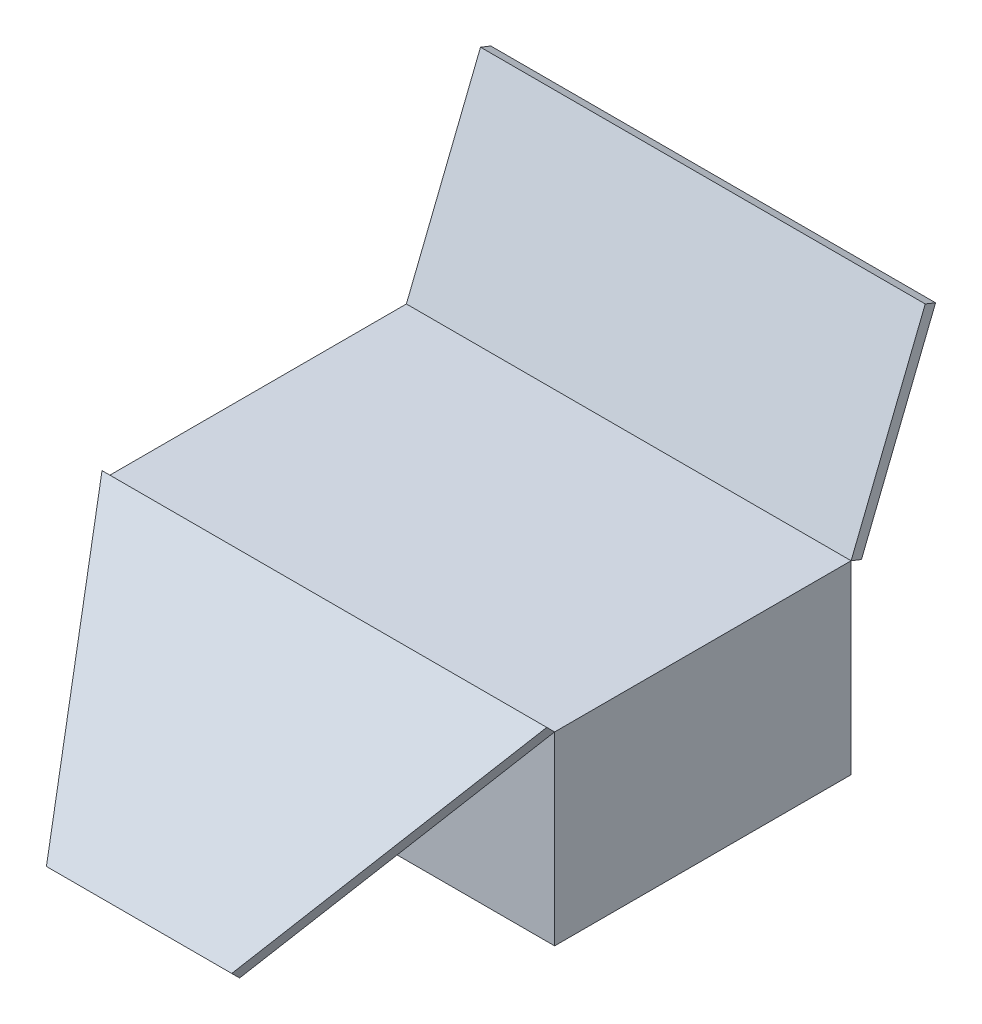
ISO-10303-21;
HEADER;
FILE_DESCRIPTION(('STEP AP214'),'2;1');
FILE_NAME('part.step','',(''),(''),'','','');
FILE_SCHEMA(('AUTOMOTIVE_DESIGN { 1 0 10303 214 1 1 1 1 }'));
ENDSEC;
DATA;
#1=APPLICATION_CONTEXT('core data for automotive mechanical design processes');
#2=APPLICATION_PROTOCOL_DEFINITION('international standard','automotive_design',2000,#1);
#3=PRODUCT_CONTEXT('',#1,'mechanical');
#4=PRODUCT('Part','Part','',(#3));
#5=PRODUCT_RELATED_PRODUCT_CATEGORY('part','',(#4));
#6=PRODUCT_DEFINITION_FORMATION('','',#4);
#7=PRODUCT_DEFINITION_CONTEXT('part definition',#1,'design');
#8=PRODUCT_DEFINITION('design','',#6,#7);
#9=PRODUCT_DEFINITION_SHAPE('','',#8);
#10=(LENGTH_UNIT() NAMED_UNIT(*) SI_UNIT(.MILLI.,.METRE.));
#11=(NAMED_UNIT(*) PLANE_ANGLE_UNIT() SI_UNIT($,.RADIAN.));
#12=(NAMED_UNIT(*) SI_UNIT($,.STERADIAN.) SOLID_ANGLE_UNIT());
#13=UNCERTAINTY_MEASURE_WITH_UNIT(LENGTH_MEASURE(1.E-05),#10,'distance_accuracy_value','');
#14=(GEOMETRIC_REPRESENTATION_CONTEXT(3) GLOBAL_UNCERTAINTY_ASSIGNED_CONTEXT((#13)) GLOBAL_UNIT_ASSIGNED_CONTEXT((#10,
#11,#12)) REPRESENTATION_CONTEXT('',''));
#15=CARTESIAN_POINT('',(0.,0.,0.));
#16=DIRECTION('',(0.,0.,1.));
#17=DIRECTION('',(1.,0.,0.));
#18=AXIS2_PLACEMENT_3D('',#15,#16,#17);
#19=CARTESIAN_POINT('',(28.125,2.12132034355964,87.1213203435597));
#20=DIRECTION('',(0.,0.707106781186548,-0.707106781186547));
#21=DIRECTION('',(0.,0.707106781186547,0.707106781186548));
#22=AXIS2_PLACEMENT_3D('',#19,#20,#21);
#23=PLANE('',#22);
#24=DIRECTION('',(1.,0.,0.));
#25=VECTOR('',#24,1.);
#26=CARTESIAN_POINT('',(28.125,0.,85.));
#27=LINE('',#26,#25);
#28=CARTESIAN_POINT('',(-21.875,0.,85.));
#29=VERTEX_POINT('',#28);
#30=CARTESIAN_POINT('',(28.125,0.,85.));
#31=VERTEX_POINT('',#30);
#32=EDGE_CURVE('E115',#29,#31,#27,.T.);
#33=ORIENTED_EDGE('',*,*,#32,.T.);
#34=DIRECTION('',(0.,-0.707106781186547,-0.707106781186548));
#35=VECTOR('',#34,1.);
#36=CARTESIAN_POINT('',(28.125,2.12132034355964,87.1213203435597));
#37=LINE('',#36,#35);
#38=CARTESIAN_POINT('',(28.125,2.12132034355964,87.1213203435597));
#39=VERTEX_POINT('',#38);
#40=EDGE_CURVE('E12',#39,#31,#37,.T.);
#41=ORIENTED_EDGE('',*,*,#40,.F.);
#42=DIRECTION('',(1.,0.,0.));
#43=VECTOR('',#42,1.);
#44=CARTESIAN_POINT('',(28.125,2.12132034355964,87.1213203435597));
#45=LINE('',#44,#43);
#46=CARTESIAN_POINT('',(-21.875,2.12132034355964,87.1213203435597));
#47=VERTEX_POINT('',#46);
#48=EDGE_CURVE('E99',#47,#39,#45,.T.);
#49=ORIENTED_EDGE('',*,*,#48,.F.);
#50=DIRECTION('',(0.,-0.707106781186547,-0.707106781186548));
#51=VECTOR('',#50,1.);
#52=CARTESIAN_POINT('',(-21.875,2.12132034355964,87.1213203435597));
#53=LINE('',#52,#51);
#54=EDGE_CURVE('E107',#47,#29,#53,.T.);
#55=ORIENTED_EDGE('',*,*,#54,.T.);
#56=EDGE_LOOP('',(#33,#41,#49,#55));
#57=FACE_BOUND('',#56,.T.);
#58=ADVANCED_FACE('F47',(#57),#23,.F.);
#59=CARTESIAN_POINT('',(63.125,52.1213203435596,37.1213203435597));
#60=DIRECTION('',(-0.896221429896442,0.313677500463755,-0.313677500463754));
#61=DIRECTION('',(-0.330350424728106,-0.943858356366017,0.));
#62=AXIS2_PLACEMENT_3D('',#59,#60,#61);
#63=PLANE('',#62);
#64=DIRECTION('',(0.443606975367134,0.633724250524478,-0.633724250524478));
#65=VECTOR('',#64,1.);
#66=CARTESIAN_POINT('',(63.125,50.,35.));
#67=LINE('',#66,#65);
#68=CARTESIAN_POINT('',(63.125,50.,35.));
#69=VERTEX_POINT('',#68);
#70=EDGE_CURVE('E102',#31,#69,#67,.T.);
#71=ORIENTED_EDGE('',*,*,#70,.T.);
#72=DIRECTION('',(0.,-0.707106781186547,-0.707106781186548));
#73=VECTOR('',#72,1.);
#74=CARTESIAN_POINT('',(63.125,52.1213203435596,37.1213203435597));
#75=LINE('',#74,#73);
#76=CARTESIAN_POINT('',(63.125,52.1213203435596,37.1213203435597));
#77=VERTEX_POINT('',#76);
#78=EDGE_CURVE('E60',#77,#69,#75,.T.);
#79=ORIENTED_EDGE('',*,*,#78,.F.);
#80=DIRECTION('',(0.443606975367134,0.633724250524478,-0.633724250524478));
#81=VECTOR('',#80,1.);
#82=CARTESIAN_POINT('',(63.125,52.1213203435596,37.1213203435597));
#83=LINE('',#82,#81);
#84=EDGE_CURVE('E92',#39,#77,#83,.T.);
#85=ORIENTED_EDGE('',*,*,#84,.F.);
#86=ORIENTED_EDGE('',*,*,#40,.T.);
#87=EDGE_LOOP('',(#71,#79,#85,#86));
#88=FACE_BOUND('',#87,.T.);
#89=ADVANCED_FACE('F103',(#88),#63,.F.);
#90=CARTESIAN_POINT('',(-56.875,52.1213203435596,37.1213203435597));
#91=DIRECTION('',(0.,-0.707106781186548,0.707106781186547));
#92=DIRECTION('',(0.,-0.707106781186547,-0.707106781186548));
#93=AXIS2_PLACEMENT_3D('',#90,#91,#92);
#94=PLANE('',#93);
#95=DIRECTION('',(-1.,0.,0.));
#96=VECTOR('',#95,1.);
#97=CARTESIAN_POINT('',(-56.875,50.,35.));
#98=LINE('',#97,#96);
#99=CARTESIAN_POINT('',(-56.875,50.,35.));
#100=VERTEX_POINT('',#99);
#101=EDGE_CURVE('E85',#69,#100,#98,.T.);
#102=ORIENTED_EDGE('',*,*,#101,.T.);
#103=DIRECTION('',(0.,-0.707106781186547,-0.707106781186548));
#104=VECTOR('',#103,1.);
#105=CARTESIAN_POINT('',(-56.875,52.1213203435596,37.1213203435597));
#106=LINE('',#105,#104);
#107=CARTESIAN_POINT('',(-56.875,52.1213203435596,37.1213203435597));
#108=VERTEX_POINT('',#107);
#109=EDGE_CURVE('E104',#108,#100,#106,.T.);
#110=ORIENTED_EDGE('',*,*,#109,.F.);
#111=DIRECTION('',(-1.,0.,0.));
#112=VECTOR('',#111,1.);
#113=CARTESIAN_POINT('',(-56.875,52.1213203435596,37.1213203435597));
#114=LINE('',#113,#112);
#115=EDGE_CURVE('E98',#77,#108,#114,.T.);
#116=ORIENTED_EDGE('',*,*,#115,.F.);
#117=ORIENTED_EDGE('',*,*,#78,.T.);
#118=EDGE_LOOP('',(#102,#110,#116,#117));
#119=FACE_BOUND('',#118,.T.);
#120=ADVANCED_FACE('F106',(#119),#94,.F.);
#121=CARTESIAN_POINT('',(-21.875,2.12132034355964,87.1213203435597));
#122=DIRECTION('',(0.896221429896442,0.313677500463755,-0.313677500463754));
#123=DIRECTION('',(-0.330350424728106,0.943858356366017,0.));
#124=AXIS2_PLACEMENT_3D('',#121,#122,#123);
#125=PLANE('',#124);
#126=DIRECTION('',(0.443606975367134,-0.633724250524478,0.633724250524478));
#127=VECTOR('',#126,1.);
#128=CARTESIAN_POINT('',(-21.875,0.,85.));
#129=LINE('',#128,#127);
#130=EDGE_CURVE('E86',#100,#29,#129,.T.);
#131=ORIENTED_EDGE('',*,*,#130,.T.);
#132=ORIENTED_EDGE('',*,*,#54,.F.);
#133=DIRECTION('',(0.443606975367134,-0.633724250524478,0.633724250524478));
#134=VECTOR('',#133,1.);
#135=CARTESIAN_POINT('',(-21.875,2.12132034355964,87.1213203435597));
#136=LINE('',#135,#134);
#137=EDGE_CURVE('E63',#108,#47,#136,.T.);
#138=ORIENTED_EDGE('',*,*,#137,.F.);
#139=ORIENTED_EDGE('',*,*,#109,.T.);
#140=EDGE_LOOP('',(#131,#132,#138,#139));
#141=FACE_BOUND('',#140,.T.);
#142=ADVANCED_FACE('F116',(#141),#125,.F.);
#143=CARTESIAN_POINT('',(0.,44.6213203435596,44.6213203435597));
#144=DIRECTION('',(0.,-0.707106781186547,-0.707106781186548));
#145=DIRECTION('',(0.,0.707106781186548,-0.707106781186547));
#146=AXIS2_PLACEMENT_3D('',#143,#144,#145);
#147=PLANE('',#146);
#148=ORIENTED_EDGE('',*,*,#48,.T.);
#149=ORIENTED_EDGE('',*,*,#84,.T.);
#150=ORIENTED_EDGE('',*,*,#115,.T.);
#151=ORIENTED_EDGE('',*,*,#137,.T.);
#152=EDGE_LOOP('',(#148,#149,#150,#151));
#153=FACE_BOUND('',#152,.T.);
#154=ADVANCED_FACE('F96',(#153),#147,.F.);
#155=CARTESIAN_POINT('',(0.,42.5,42.5));
#156=DIRECTION('',(0.,-0.707106781186547,-0.707106781186548));
#157=DIRECTION('',(0.,0.707106781186548,-0.707106781186547));
#158=AXIS2_PLACEMENT_3D('',#155,#156,#157);
#159=PLANE('',#158);
#160=ORIENTED_EDGE('',*,*,#32,.F.);
#161=ORIENTED_EDGE('',*,*,#130,.F.);
#162=ORIENTED_EDGE('',*,*,#101,.F.);
#163=ORIENTED_EDGE('',*,*,#70,.F.);
#164=EDGE_LOOP('',(#160,#161,#162,#163));
#165=FACE_BOUND('',#164,.T.);
#166=ADVANCED_FACE('F125',(#165),#159,.T.);
#167=CLOSED_SHELL('',(#58,#89,#120,#142,#154,#166));
#168=MANIFOLD_SOLID_BREP('B2',#167);
#169=CARTESIAN_POINT('',(63.125,98.8858279709377,-67.7854300726558));
#170=DIRECTION('',(-1.,0.,0.));
#171=DIRECTION('',(0.,0.,1.));
#172=AXIS2_PLACEMENT_3D('',#169,#170,#171);
#173=PLANE('',#172);
#174=DIRECTION('',(0.,-0.928476690885259,0.371390676354104));
#175=VECTOR('',#174,1.);
#176=CARTESIAN_POINT('',(63.125,100.,-65.));
#177=LINE('',#176,#175);
#178=CARTESIAN_POINT('',(63.125,100.,-65.));
#179=VERTEX_POINT('',#178);
#180=CARTESIAN_POINT('',(63.125,50.,-45.));
#181=VERTEX_POINT('',#180);
#182=EDGE_CURVE('E241',#179,#181,#177,.T.);
#183=ORIENTED_EDGE('',*,*,#182,.T.);
#184=DIRECTION('',(0.,0.371390676354104,0.928476690885259));
#185=VECTOR('',#184,1.);
#186=CARTESIAN_POINT('',(63.125,48.8858279709377,-47.7854300726558));
#187=LINE('',#186,#185);
#188=CARTESIAN_POINT('',(63.125,48.8858279709377,-47.7854300726558));
#189=VERTEX_POINT('',#188);
#190=EDGE_CURVE('E50',#189,#181,#187,.T.);
#191=ORIENTED_EDGE('',*,*,#190,.F.);
#192=DIRECTION('',(0.,-0.928476690885259,0.371390676354104));
#193=VECTOR('',#192,1.);
#194=CARTESIAN_POINT('',(63.125,98.8858279709377,-67.7854300726558));
#195=LINE('',#194,#193);
#196=CARTESIAN_POINT('',(63.125,98.8858279709377,-67.7854300726558));
#197=VERTEX_POINT('',#196);
#198=EDGE_CURVE('E235',#197,#189,#195,.T.);
#199=ORIENTED_EDGE('',*,*,#198,.F.);
#200=DIRECTION('',(0.,0.371390676354104,0.928476690885259));
#201=VECTOR('',#200,1.);
#202=CARTESIAN_POINT('',(63.125,98.8858279709377,-67.7854300726558));
#203=LINE('',#202,#201);
#204=EDGE_CURVE('E238',#197,#179,#203,.T.);
#205=ORIENTED_EDGE('',*,*,#204,.T.);
#206=EDGE_LOOP('',(#183,#191,#199,#205));
#207=FACE_BOUND('',#206,.T.);
#208=ADVANCED_FACE('F182',(#207),#173,.F.);
#209=CARTESIAN_POINT('',(63.125,48.8858279709377,-47.7854300726558));
#210=DIRECTION('',(0.,0.928476690885259,-0.371390676354104));
#211=DIRECTION('',(0.,0.371390676354104,0.928476690885259));
#212=AXIS2_PLACEMENT_3D('',#209,#210,#211);
#213=PLANE('',#212);
#214=DIRECTION('',(-1.,0.,0.));
#215=VECTOR('',#214,1.);
#216=CARTESIAN_POINT('',(63.125,50.,-45.));
#217=LINE('',#216,#215);
#218=CARTESIAN_POINT('',(-56.875,50.,-45.));
#219=VERTEX_POINT('',#218);
#220=EDGE_CURVE('E237',#181,#219,#217,.T.);
#221=ORIENTED_EDGE('',*,*,#220,.T.);
#222=DIRECTION('',(0.,0.371390676354104,0.928476690885259));
#223=VECTOR('',#222,1.);
#224=CARTESIAN_POINT('',(-56.875,48.8858279709377,-47.7854300726558));
#225=LINE('',#224,#223);
#226=CARTESIAN_POINT('',(-56.875,48.8858279709377,-47.7854300726558));
#227=VERTEX_POINT('',#226);
#228=EDGE_CURVE('E186',#227,#219,#225,.T.);
#229=ORIENTED_EDGE('',*,*,#228,.F.);
#230=DIRECTION('',(-1.,0.,0.));
#231=VECTOR('',#230,1.);
#232=CARTESIAN_POINT('',(63.125,48.8858279709377,-47.7854300726558));
#233=LINE('',#232,#231);
#234=EDGE_CURVE('E230',#189,#227,#233,.T.);
#235=ORIENTED_EDGE('',*,*,#234,.F.);
#236=ORIENTED_EDGE('',*,*,#190,.T.);
#237=EDGE_LOOP('',(#221,#229,#235,#236));
#238=FACE_BOUND('',#237,.T.);
#239=ADVANCED_FACE('F234',(#238),#213,.F.);
#240=CARTESIAN_POINT('',(-56.875,98.8858279709377,-67.7854300726558));
#241=DIRECTION('',(1.,0.,0.));
#242=DIRECTION('',(0.,0.,-1.));
#243=AXIS2_PLACEMENT_3D('',#240,#241,#242);
#244=PLANE('',#243);
#245=DIRECTION('',(0.,0.928476690885259,-0.371390676354104));
#246=VECTOR('',#245,1.);
#247=CARTESIAN_POINT('',(-56.875,100.,-65.));
#248=LINE('',#247,#246);
#249=CARTESIAN_POINT('',(-56.875,100.,-65.));
#250=VERTEX_POINT('',#249);
#251=EDGE_CURVE('E212',#219,#250,#248,.T.);
#252=ORIENTED_EDGE('',*,*,#251,.T.);
#253=DIRECTION('',(0.,0.371390676354104,0.928476690885259));
#254=VECTOR('',#253,1.);
#255=CARTESIAN_POINT('',(-56.875,98.8858279709377,-67.7854300726558));
#256=LINE('',#255,#254);
#257=CARTESIAN_POINT('',(-56.875,98.8858279709377,-67.7854300726558));
#258=VERTEX_POINT('',#257);
#259=EDGE_CURVE('E240',#258,#250,#256,.T.);
#260=ORIENTED_EDGE('',*,*,#259,.F.);
#261=DIRECTION('',(0.,0.928476690885259,-0.371390676354104));
#262=VECTOR('',#261,1.);
#263=CARTESIAN_POINT('',(-56.875,98.8858279709377,-67.7854300726558));
#264=LINE('',#263,#262);
#265=EDGE_CURVE('E228',#227,#258,#264,.T.);
#266=ORIENTED_EDGE('',*,*,#265,.F.);
#267=ORIENTED_EDGE('',*,*,#228,.T.);
#268=EDGE_LOOP('',(#252,#260,#266,#267));
#269=FACE_BOUND('',#268,.T.);
#270=ADVANCED_FACE('F236',(#269),#244,.F.);
#271=CARTESIAN_POINT('',(63.125,98.8858279709377,-67.7854300726558));
#272=DIRECTION('',(0.,-0.928476690885259,0.371390676354104));
#273=DIRECTION('',(0.,-0.371390676354104,-0.928476690885259));
#274=AXIS2_PLACEMENT_3D('',#271,#272,#273);
#275=PLANE('',#274);
#276=DIRECTION('',(1.,0.,0.));
#277=VECTOR('',#276,1.);
#278=CARTESIAN_POINT('',(63.125,100.,-65.));
#279=LINE('',#278,#277);
#280=EDGE_CURVE('E219',#250,#179,#279,.T.);
#281=ORIENTED_EDGE('',*,*,#280,.T.);
#282=ORIENTED_EDGE('',*,*,#204,.F.);
#283=DIRECTION('',(1.,0.,0.));
#284=VECTOR('',#283,1.);
#285=CARTESIAN_POINT('',(63.125,98.8858279709377,-67.7854300726558));
#286=LINE('',#285,#284);
#287=EDGE_CURVE('E197',#258,#197,#286,.T.);
#288=ORIENTED_EDGE('',*,*,#287,.F.);
#289=ORIENTED_EDGE('',*,*,#259,.T.);
#290=EDGE_LOOP('',(#281,#282,#288,#289));
#291=FACE_BOUND('',#290,.T.);
#292=ADVANCED_FACE('F253',(#291),#275,.F.);
#293=CARTESIAN_POINT('',(0.,-9.73486168423472,-24.3371542105868));
#294=DIRECTION('',(0.,-0.371390676354104,-0.928476690885259));
#295=DIRECTION('',(0.,0.928476690885259,-0.371390676354104));
#296=AXIS2_PLACEMENT_3D('',#293,#294,#295);
#297=PLANE('',#296);
#298=ORIENTED_EDGE('',*,*,#198,.T.);
#299=ORIENTED_EDGE('',*,*,#234,.T.);
#300=ORIENTED_EDGE('',*,*,#265,.T.);
#301=ORIENTED_EDGE('',*,*,#287,.T.);
#302=EDGE_LOOP('',(#298,#299,#300,#301));
#303=FACE_BOUND('',#302,.T.);
#304=ADVANCED_FACE('F229',(#303),#297,.T.);
#305=CARTESIAN_POINT('',(0.,-8.62068965517241,-21.551724137931));
#306=DIRECTION('',(0.,-0.371390676354104,-0.928476690885259));
#307=DIRECTION('',(0.,0.928476690885259,-0.371390676354104));
#308=AXIS2_PLACEMENT_3D('',#305,#306,#307);
#309=PLANE('',#308);
#310=ORIENTED_EDGE('',*,*,#182,.F.);
#311=ORIENTED_EDGE('',*,*,#280,.F.);
#312=ORIENTED_EDGE('',*,*,#251,.F.);
#313=ORIENTED_EDGE('',*,*,#220,.F.);
#314=EDGE_LOOP('',(#310,#311,#312,#313));
#315=FACE_BOUND('',#314,.T.);
#316=ADVANCED_FACE('F255',(#315),#309,.F.);
#317=CLOSED_SHELL('',(#208,#239,#270,#292,#304,#316));
#318=MANIFOLD_SOLID_BREP('B6',#317);
#319=CARTESIAN_POINT('',(-56.875,50.,-45.));
#320=DIRECTION('',(1.,0.,0.));
#321=DIRECTION('',(0.,0.,-1.));
#322=AXIS2_PLACEMENT_3D('',#319,#320,#321);
#323=PLANE('',#322);
#324=DIRECTION('',(0.,0.,1.));
#325=VECTOR('',#324,1.);
#326=CARTESIAN_POINT('',(-56.875,0.,-45.));
#327=LINE('',#326,#325);
#328=CARTESIAN_POINT('',(-56.875,0.,-45.));
#329=VERTEX_POINT('',#328);
#330=CARTESIAN_POINT('',(-56.875,0.,35.));
#331=VERTEX_POINT('',#330);
#332=EDGE_CURVE('E411',#329,#331,#327,.T.);
#333=ORIENTED_EDGE('',*,*,#332,.T.);
#334=DIRECTION('',(0.,-1.,0.));
#335=VECTOR('',#334,1.);
#336=CARTESIAN_POINT('',(-56.875,50.,35.));
#337=LINE('',#336,#335);
#338=CARTESIAN_POINT('',(-56.875,50.,35.));
#339=VERTEX_POINT('',#338);
#340=EDGE_CURVE('E177',#339,#331,#337,.T.);
#341=ORIENTED_EDGE('',*,*,#340,.F.);
#342=DIRECTION('',(0.,0.,1.));
#343=VECTOR('',#342,1.);
#344=CARTESIAN_POINT('',(-56.875,50.,-45.));
#345=LINE('',#344,#343);
#346=CARTESIAN_POINT('',(-56.875,50.,-45.));
#347=VERTEX_POINT('',#346);
#348=EDGE_CURVE('E417',#347,#339,#345,.T.);
#349=ORIENTED_EDGE('',*,*,#348,.F.);
#350=DIRECTION('',(0.,-1.,0.));
#351=VECTOR('',#350,1.);
#352=CARTESIAN_POINT('',(-56.875,50.,-45.));
#353=LINE('',#352,#351);
#354=EDGE_CURVE('E421',#347,#329,#353,.T.);
#355=ORIENTED_EDGE('',*,*,#354,.T.);
#356=EDGE_LOOP('',(#333,#341,#349,#355));
#357=FACE_BOUND('',#356,.T.);
#358=ADVANCED_FACE('F304',(#357),#323,.F.);
#359=CARTESIAN_POINT('',(-56.875,50.,35.));
#360=DIRECTION('',(0.,0.,-1.));
#361=DIRECTION('',(-1.,0.,0.));
#362=AXIS2_PLACEMENT_3D('',#359,#360,#361);
#363=PLANE('',#362);
#364=DIRECTION('',(1.,0.,0.));
#365=VECTOR('',#364,1.);
#366=CARTESIAN_POINT('',(-56.875,0.,35.));
#367=LINE('',#366,#365);
#368=CARTESIAN_POINT('',(63.125,0.,35.));
#369=VERTEX_POINT('',#368);
#370=EDGE_CURVE('E426',#331,#369,#367,.T.);
#371=ORIENTED_EDGE('',*,*,#370,.T.);
#372=DIRECTION('',(0.,-1.,0.));
#373=VECTOR('',#372,1.);
#374=CARTESIAN_POINT('',(63.125,50.,35.));
#375=LINE('',#374,#373);
#376=CARTESIAN_POINT('',(63.125,50.,35.));
#377=VERTEX_POINT('',#376);
#378=EDGE_CURVE('E315',#377,#369,#375,.T.);
#379=ORIENTED_EDGE('',*,*,#378,.F.);
#380=DIRECTION('',(1.,0.,0.));
#381=VECTOR('',#380,1.);
#382=CARTESIAN_POINT('',(-56.875,50.,35.));
#383=LINE('',#382,#381);
#384=EDGE_CURVE('E358',#339,#377,#383,.T.);
#385=ORIENTED_EDGE('',*,*,#384,.F.);
#386=ORIENTED_EDGE('',*,*,#340,.T.);
#387=EDGE_LOOP('',(#371,#379,#385,#386));
#388=FACE_BOUND('',#387,.T.);
#389=ADVANCED_FACE('F452',(#388),#363,.F.);
#390=CARTESIAN_POINT('',(63.125,50.,-45.));
#391=DIRECTION('',(-1.,0.,0.));
#392=DIRECTION('',(0.,0.,1.));
#393=AXIS2_PLACEMENT_3D('',#390,#391,#392);
#394=PLANE('',#393);
#395=DIRECTION('',(0.,0.,-1.));
#396=VECTOR('',#395,1.);
#397=CARTESIAN_POINT('',(63.125,0.,-45.));
#398=LINE('',#397,#396);
#399=CARTESIAN_POINT('',(63.125,0.,-45.));
#400=VERTEX_POINT('',#399);
#401=EDGE_CURVE('E428',#369,#400,#398,.T.);
#402=ORIENTED_EDGE('',*,*,#401,.T.);
#403=DIRECTION('',(0.,-1.,0.));
#404=VECTOR('',#403,1.);
#405=CARTESIAN_POINT('',(63.125,50.,-45.));
#406=LINE('',#405,#404);
#407=CARTESIAN_POINT('',(63.125,50.,-45.));
#408=VERTEX_POINT('',#407);
#409=EDGE_CURVE('E435',#408,#400,#406,.T.);
#410=ORIENTED_EDGE('',*,*,#409,.F.);
#411=DIRECTION('',(0.,0.,-1.));
#412=VECTOR('',#411,1.);
#413=CARTESIAN_POINT('',(63.125,50.,-45.));
#414=LINE('',#413,#412);
#415=EDGE_CURVE('E419',#377,#408,#414,.T.);
#416=ORIENTED_EDGE('',*,*,#415,.F.);
#417=ORIENTED_EDGE('',*,*,#378,.T.);
#418=EDGE_LOOP('',(#402,#410,#416,#417));
#419=FACE_BOUND('',#418,.T.);
#420=ADVANCED_FACE('F440',(#419),#394,.F.);
#421=CARTESIAN_POINT('',(-56.875,50.,-45.));
#422=DIRECTION('',(0.,0.,1.));
#423=DIRECTION('',(1.,0.,0.));
#424=AXIS2_PLACEMENT_3D('',#421,#422,#423);
#425=PLANE('',#424);
#426=DIRECTION('',(-1.,0.,0.));
#427=VECTOR('',#426,1.);
#428=CARTESIAN_POINT('',(-56.875,0.,-45.));
#429=LINE('',#428,#427);
#430=EDGE_CURVE('E349',#400,#329,#429,.T.);
#431=ORIENTED_EDGE('',*,*,#430,.T.);
#432=ORIENTED_EDGE('',*,*,#354,.F.);
#433=DIRECTION('',(-1.,0.,0.));
#434=VECTOR('',#433,1.);
#435=CARTESIAN_POINT('',(-56.875,50.,-45.));
#436=LINE('',#435,#434);
#437=EDGE_CURVE('E327',#408,#347,#436,.T.);
#438=ORIENTED_EDGE('',*,*,#437,.F.);
#439=ORIENTED_EDGE('',*,*,#409,.T.);
#440=EDGE_LOOP('',(#431,#432,#438,#439));
#441=FACE_BOUND('',#440,.T.);
#442=ADVANCED_FACE('F443',(#441),#425,.F.);
#443=CARTESIAN_POINT('',(0.,50.,0.));
#444=DIRECTION('',(0.,1.,0.));
#445=DIRECTION('',(0.,0.,1.));
#446=AXIS2_PLACEMENT_3D('',#443,#444,#445);
#447=PLANE('',#446);
#448=ORIENTED_EDGE('',*,*,#348,.T.);
#449=ORIENTED_EDGE('',*,*,#384,.T.);
#450=ORIENTED_EDGE('',*,*,#415,.T.);
#451=ORIENTED_EDGE('',*,*,#437,.T.);
#452=EDGE_LOOP('',(#448,#449,#450,#451));
#453=FACE_BOUND('',#452,.T.);
#454=ADVANCED_FACE('F450',(#453),#447,.T.);
#455=CARTESIAN_POINT('',(0.,0.,0.));
#456=DIRECTION('',(0.,1.,0.));
#457=DIRECTION('',(0.,0.,1.));
#458=AXIS2_PLACEMENT_3D('',#455,#456,#457);
#459=PLANE('',#458);
#460=DIRECTION('',(1.,0.,0.));
#461=VECTOR('',#460,1.);
#462=CARTESIAN_POINT('',(15.625,0.,-35.));
#463=LINE('',#462,#461);
#464=CARTESIAN_POINT('',(-9.37499999999999,0.,-35.));
#465=VERTEX_POINT('',#464);
#466=CARTESIAN_POINT('',(15.625,0.,-35.));
#467=VERTEX_POINT('',#466);
#468=EDGE_CURVE('E410',#465,#467,#463,.T.);
#469=ORIENTED_EDGE('',*,*,#468,.F.);
#470=DIRECTION('',(0.,0.,-1.));
#471=VECTOR('',#470,1.);
#472=CARTESIAN_POINT('',(-9.37499999999999,0.,-35.));
#473=LINE('',#472,#471);
#474=CARTESIAN_POINT('',(-9.37499999999999,0.,25.));
#475=VERTEX_POINT('',#474);
#476=EDGE_CURVE('E317',#475,#465,#473,.T.);
#477=ORIENTED_EDGE('',*,*,#476,.F.);
#478=DIRECTION('',(-1.,0.,0.));
#479=VECTOR('',#478,1.);
#480=CARTESIAN_POINT('',(15.625,0.,25.));
#481=LINE('',#480,#479);
#482=CARTESIAN_POINT('',(15.625,0.,25.));
#483=VERTEX_POINT('',#482);
#484=EDGE_CURVE('E396',#483,#475,#481,.T.);
#485=ORIENTED_EDGE('',*,*,#484,.F.);
#486=DIRECTION('',(0.,0.,1.));
#487=VECTOR('',#486,1.);
#488=CARTESIAN_POINT('',(15.625,0.,-35.));
#489=LINE('',#488,#487);
#490=EDGE_CURVE('E402',#467,#483,#489,.T.);
#491=ORIENTED_EDGE('',*,*,#490,.F.);
#492=EDGE_LOOP('',(#469,#477,#485,#491));
#493=FACE_BOUND('',#492,.T.);
#494=ORIENTED_EDGE('',*,*,#332,.F.);
#495=ORIENTED_EDGE('',*,*,#430,.F.);
#496=ORIENTED_EDGE('',*,*,#401,.F.);
#497=ORIENTED_EDGE('',*,*,#370,.F.);
#498=EDGE_LOOP('',(#494,#495,#496,#497));
#499=FACE_BOUND('',#498,.T.);
#500=ADVANCED_FACE('F442',(#493,#499),#459,.F.);
#501=CARTESIAN_POINT('',(-9.37499999999999,45.,-35.));
#502=DIRECTION('',(-1.,0.,0.));
#503=DIRECTION('',(0.,0.,1.));
#504=AXIS2_PLACEMENT_3D('',#501,#502,#503);
#505=PLANE('',#504);
#506=ORIENTED_EDGE('',*,*,#476,.T.);
#507=DIRECTION('',(0.,-1.,0.));
#508=VECTOR('',#507,1.);
#509=CARTESIAN_POINT('',(-9.37499999999999,45.,-35.));
#510=LINE('',#509,#508);
#511=CARTESIAN_POINT('',(-9.37499999999999,45.,-35.));
#512=VERTEX_POINT('',#511);
#513=EDGE_CURVE('E376',#512,#465,#510,.T.);
#514=ORIENTED_EDGE('',*,*,#513,.F.);
#515=DIRECTION('',(0.,0.,-1.));
#516=VECTOR('',#515,1.);
#517=CARTESIAN_POINT('',(-9.37499999999999,45.,-35.));
#518=LINE('',#517,#516);
#519=CARTESIAN_POINT('',(-9.37499999999999,45.,25.));
#520=VERTEX_POINT('',#519);
#521=EDGE_CURVE('E379',#520,#512,#518,.T.);
#522=ORIENTED_EDGE('',*,*,#521,.F.);
#523=DIRECTION('',(0.,-1.,0.));
#524=VECTOR('',#523,1.);
#525=CARTESIAN_POINT('',(-9.37499999999999,45.,25.));
#526=LINE('',#525,#524);
#527=EDGE_CURVE('E413',#520,#475,#526,.T.);
#528=ORIENTED_EDGE('',*,*,#527,.T.);
#529=EDGE_LOOP('',(#506,#514,#522,#528));
#530=FACE_BOUND('',#529,.T.);
#531=ADVANCED_FACE('F378',(#530),#505,.F.);
#532=CARTESIAN_POINT('',(15.625,45.,25.));
#533=DIRECTION('',(0.,0.,1.));
#534=DIRECTION('',(1.,0.,0.));
#535=AXIS2_PLACEMENT_3D('',#532,#533,#534);
#536=PLANE('',#535);
#537=ORIENTED_EDGE('',*,*,#484,.T.);
#538=ORIENTED_EDGE('',*,*,#527,.F.);
#539=DIRECTION('',(-1.,0.,0.));
#540=VECTOR('',#539,1.);
#541=CARTESIAN_POINT('',(15.625,45.,25.));
#542=LINE('',#541,#540);
#543=CARTESIAN_POINT('',(15.625,45.,25.));
#544=VERTEX_POINT('',#543);
#545=EDGE_CURVE('E387',#544,#520,#542,.T.);
#546=ORIENTED_EDGE('',*,*,#545,.F.);
#547=DIRECTION('',(0.,-1.,0.));
#548=VECTOR('',#547,1.);
#549=CARTESIAN_POINT('',(15.625,45.,25.));
#550=LINE('',#549,#548);
#551=EDGE_CURVE('E412',#544,#483,#550,.T.);
#552=ORIENTED_EDGE('',*,*,#551,.T.);
#553=EDGE_LOOP('',(#537,#538,#546,#552));
#554=FACE_BOUND('',#553,.T.);
#555=ADVANCED_FACE('F497',(#554),#536,.F.);
#556=CARTESIAN_POINT('',(15.625,45.,-35.));
#557=DIRECTION('',(1.,0.,0.));
#558=DIRECTION('',(0.,0.,-1.));
#559=AXIS2_PLACEMENT_3D('',#556,#557,#558);
#560=PLANE('',#559);
#561=ORIENTED_EDGE('',*,*,#490,.T.);
#562=ORIENTED_EDGE('',*,*,#551,.F.);
#563=DIRECTION('',(0.,0.,1.));
#564=VECTOR('',#563,1.);
#565=CARTESIAN_POINT('',(15.625,45.,-35.));
#566=LINE('',#565,#564);
#567=CARTESIAN_POINT('',(15.625,45.,-35.));
#568=VERTEX_POINT('',#567);
#569=EDGE_CURVE('E391',#568,#544,#566,.T.);
#570=ORIENTED_EDGE('',*,*,#569,.F.);
#571=DIRECTION('',(0.,-1.,0.));
#572=VECTOR('',#571,1.);
#573=CARTESIAN_POINT('',(15.625,45.,-35.));
#574=LINE('',#573,#572);
#575=EDGE_CURVE('E384',#568,#467,#574,.T.);
#576=ORIENTED_EDGE('',*,*,#575,.T.);
#577=EDGE_LOOP('',(#561,#562,#570,#576));
#578=FACE_BOUND('',#577,.T.);
#579=ADVANCED_FACE('F503',(#578),#560,.F.);
#580=CARTESIAN_POINT('',(15.625,45.,-35.));
#581=DIRECTION('',(0.,0.,-1.));
#582=DIRECTION('',(-1.,0.,0.));
#583=AXIS2_PLACEMENT_3D('',#580,#581,#582);
#584=PLANE('',#583);
#585=ORIENTED_EDGE('',*,*,#468,.T.);
#586=ORIENTED_EDGE('',*,*,#575,.F.);
#587=DIRECTION('',(1.,0.,0.));
#588=VECTOR('',#587,1.);
#589=CARTESIAN_POINT('',(15.625,45.,-35.));
#590=LINE('',#589,#588);
#591=EDGE_CURVE('E386',#512,#568,#590,.T.);
#592=ORIENTED_EDGE('',*,*,#591,.F.);
#593=ORIENTED_EDGE('',*,*,#513,.T.);
#594=EDGE_LOOP('',(#585,#586,#592,#593));
#595=FACE_BOUND('',#594,.T.);
#596=ADVANCED_FACE('F388',(#595),#584,.F.);
#597=CARTESIAN_POINT('',(0.,45.,0.));
#598=DIRECTION('',(0.,-1.,0.));
#599=DIRECTION('',(0.,0.,-1.));
#600=AXIS2_PLACEMENT_3D('',#597,#598,#599);
#601=PLANE('',#600);
#602=ORIENTED_EDGE('',*,*,#521,.T.);
#603=ORIENTED_EDGE('',*,*,#591,.T.);
#604=ORIENTED_EDGE('',*,*,#569,.T.);
#605=ORIENTED_EDGE('',*,*,#545,.T.);
#606=EDGE_LOOP('',(#602,#603,#604,#605));
#607=FACE_BOUND('',#606,.T.);
#608=ADVANCED_FACE('F398',(#607),#601,.T.);
#609=CLOSED_SHELL('',(#358,#389,#420,#442,#454,#500,#531,#555,#579,#596,#608));
#610=MANIFOLD_SOLID_BREP('B41',#609);
#611=ADVANCED_BREP_SHAPE_REPRESENTATION('',(#18,#168,#318,#610),#14);
#612=SHAPE_DEFINITION_REPRESENTATION(#9,#611);
ENDSEC;
END-ISO-10303-21;
